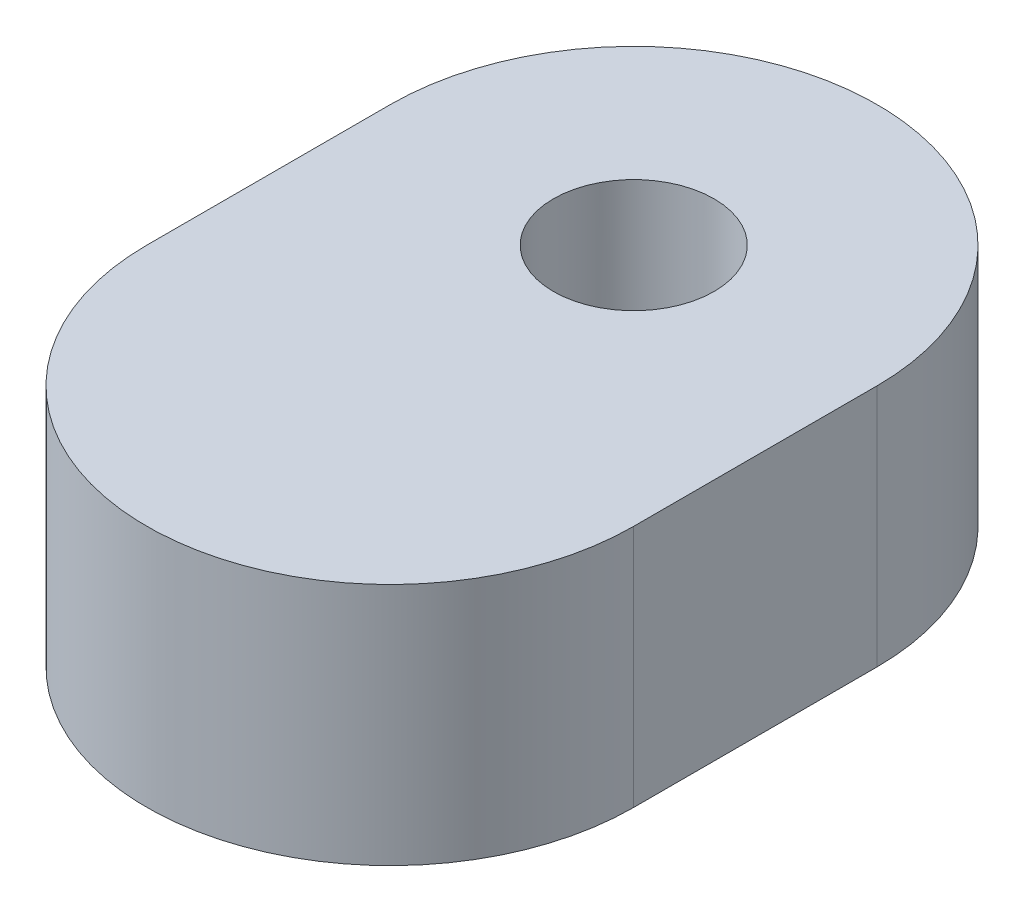
ISO-10303-21;
HEADER;
FILE_DESCRIPTION(('STEP AP214'),'2;1');
FILE_NAME('part.step','',(''),(''),'','','');
FILE_SCHEMA(('AUTOMOTIVE_DESIGN { 1 0 10303 214 1 1 1 1 }'));
ENDSEC;
DATA;
#1=APPLICATION_CONTEXT('core data for automotive mechanical design processes');
#2=APPLICATION_PROTOCOL_DEFINITION('international standard','automotive_design',2000,#1);
#3=PRODUCT_CONTEXT('',#1,'mechanical');
#4=PRODUCT('Part','Part','',(#3));
#5=PRODUCT_RELATED_PRODUCT_CATEGORY('part','',(#4));
#6=PRODUCT_DEFINITION_FORMATION('','',#4);
#7=PRODUCT_DEFINITION_CONTEXT('part definition',#1,'design');
#8=PRODUCT_DEFINITION('design','',#6,#7);
#9=PRODUCT_DEFINITION_SHAPE('','',#8);
#10=(LENGTH_UNIT() NAMED_UNIT(*) SI_UNIT(.MILLI.,.METRE.));
#11=(NAMED_UNIT(*) PLANE_ANGLE_UNIT() SI_UNIT($,.RADIAN.));
#12=(NAMED_UNIT(*) SI_UNIT($,.STERADIAN.) SOLID_ANGLE_UNIT());
#13=UNCERTAINTY_MEASURE_WITH_UNIT(LENGTH_MEASURE(1.E-05),#10,'distance_accuracy_value','');
#14=(GEOMETRIC_REPRESENTATION_CONTEXT(3) GLOBAL_UNCERTAINTY_ASSIGNED_CONTEXT((#13)) GLOBAL_UNIT_ASSIGNED_CONTEXT((#10,
#11,#12)) REPRESENTATION_CONTEXT('',''));
#15=CARTESIAN_POINT('',(0.,0.,0.));
#16=DIRECTION('',(0.,0.,1.));
#17=DIRECTION('',(1.,0.,0.));
#18=AXIS2_PLACEMENT_3D('',#15,#16,#17);
#19=CARTESIAN_POINT('',(0.,10.,0.));
#20=DIRECTION('',(0.,-1.,0.));
#21=DIRECTION('',(0.,0.,-1.));
#22=AXIS2_PLACEMENT_3D('',#19,#20,#21);
#23=CYLINDRICAL_SURFACE('',#22,3.3);
#24=CARTESIAN_POINT('',(0.,10.,0.));
#25=DIRECTION('',(0.,1.,0.));
#26=DIRECTION('',(0.,0.,1.));
#27=AXIS2_PLACEMENT_3D('',#24,#25,#26);
#28=CIRCLE('',#27,3.3);
#29=CARTESIAN_POINT('',(0.,10.,3.3));
#30=VERTEX_POINT('',#29);
#31=EDGE_CURVE('E176',#30,#30,#28,.T.);
#32=ORIENTED_EDGE('',*,*,#31,.T.);
#33=EDGE_LOOP('',(#32));
#34=FACE_BOUND('',#33,.T.);
#35=CARTESIAN_POINT('',(0.,5.,0.));
#36=DIRECTION('',(0.,-1.,0.));
#37=DIRECTION('',(0.,0.,-1.));
#38=AXIS2_PLACEMENT_3D('',#35,#36,#37);
#39=CIRCLE('',#38,3.3);
#40=CARTESIAN_POINT('',(0.,5.,-3.3));
#41=VERTEX_POINT('',#40);
#42=EDGE_CURVE('E39',#41,#41,#39,.T.);
#43=ORIENTED_EDGE('',*,*,#42,.T.);
#44=EDGE_LOOP('',(#43));
#45=FACE_BOUND('',#44,.T.);
#46=ADVANCED_FACE('F35',(#34,#45),#23,.F.);
#47=CARTESIAN_POINT('',(0.,10.,0.));
#48=DIRECTION('',(0.,1.,0.));
#49=DIRECTION('',(0.,0.,1.));
#50=AXIS2_PLACEMENT_3D('',#47,#48,#49);
#51=PLANE('',#50);
#52=CARTESIAN_POINT('',(0.,10.,0.));
#53=DIRECTION('',(0.,1.,0.));
#54=DIRECTION('',(0.,0.,1.));
#55=AXIS2_PLACEMENT_3D('',#52,#53,#54);
#56=CIRCLE('',#55,10.);
#57=CARTESIAN_POINT('',(10.,10.,0.));
#58=VERTEX_POINT('',#57);
#59=CARTESIAN_POINT('',(-10.,10.,0.));
#60=VERTEX_POINT('',#59);
#61=EDGE_CURVE('E180',#58,#60,#56,.T.);
#62=ORIENTED_EDGE('',*,*,#61,.T.);
#63=DIRECTION('',(0.,0.,1.));
#64=VECTOR('',#63,1.);
#65=CARTESIAN_POINT('',(-10.,10.,0.));
#66=LINE('',#65,#64);
#67=CARTESIAN_POINT('',(-10.,10.,10.));
#68=VERTEX_POINT('',#67);
#69=EDGE_CURVE('E88',#60,#68,#66,.T.);
#70=ORIENTED_EDGE('',*,*,#69,.T.);
#71=CARTESIAN_POINT('',(0.,10.,10.));
#72=DIRECTION('',(0.,1.,0.));
#73=DIRECTION('',(0.,0.,1.));
#74=AXIS2_PLACEMENT_3D('',#71,#72,#73);
#75=CIRCLE('',#74,10.);
#76=CARTESIAN_POINT('',(10.,10.,10.));
#77=VERTEX_POINT('',#76);
#78=EDGE_CURVE('E183',#68,#77,#75,.T.);
#79=ORIENTED_EDGE('',*,*,#78,.T.);
#80=DIRECTION('',(0.,0.,-1.));
#81=VECTOR('',#80,1.);
#82=CARTESIAN_POINT('',(10.,10.,0.));
#83=LINE('',#82,#81);
#84=EDGE_CURVE('E60',#77,#58,#83,.T.);
#85=ORIENTED_EDGE('',*,*,#84,.T.);
#86=EDGE_LOOP('',(#62,#70,#79,#85));
#87=FACE_BOUND('',#86,.T.);
#88=ORIENTED_EDGE('',*,*,#31,.F.);
#89=EDGE_LOOP('',(#88));
#90=FACE_BOUND('',#89,.T.);
#91=ADVANCED_FACE('F222',(#87,#90),#51,.T.);
#92=CARTESIAN_POINT('',(0.,0.,0.));
#93=DIRECTION('',(0.,1.,0.));
#94=DIRECTION('',(0.,0.,1.));
#95=AXIS2_PLACEMENT_3D('',#92,#93,#94);
#96=PLANE('',#95);
#97=DIRECTION('',(-0.866025403784439,0.,0.5));
#98=VECTOR('',#97,1.);
#99=CARTESIAN_POINT('',(6.5,0.,3.75277674973257));
#100=LINE('',#99,#98);
#101=CARTESIAN_POINT('',(6.5,0.,3.75277674973257));
#102=VERTEX_POINT('',#101);
#103=CARTESIAN_POINT('',(0.,0.,7.50555349946513));
#104=VERTEX_POINT('',#103);
#105=EDGE_CURVE('E157',#102,#104,#100,.T.);
#106=ORIENTED_EDGE('',*,*,#105,.F.);
#107=DIRECTION('',(0.,0.,1.));
#108=VECTOR('',#107,1.);
#109=CARTESIAN_POINT('',(6.5,0.,-3.75277674973257));
#110=LINE('',#109,#108);
#111=CARTESIAN_POINT('',(6.5,0.,-3.75277674973257));
#112=VERTEX_POINT('',#111);
#113=EDGE_CURVE('E51',#112,#102,#110,.T.);
#114=ORIENTED_EDGE('',*,*,#113,.F.);
#115=DIRECTION('',(0.866025403784439,0.,0.5));
#116=VECTOR('',#115,1.);
#117=CARTESIAN_POINT('',(0.,0.,-7.50555349946513));
#118=LINE('',#117,#116);
#119=CARTESIAN_POINT('',(0.,0.,-7.50555349946513));
#120=VERTEX_POINT('',#119);
#121=EDGE_CURVE('E143',#120,#112,#118,.T.);
#122=ORIENTED_EDGE('',*,*,#121,.F.);
#123=DIRECTION('',(0.866025403784439,0.,-0.5));
#124=VECTOR('',#123,1.);
#125=CARTESIAN_POINT('',(-6.5,0.,-3.75277674973257));
#126=LINE('',#125,#124);
#127=CARTESIAN_POINT('',(-6.5,0.,-3.75277674973257));
#128=VERTEX_POINT('',#127);
#129=EDGE_CURVE('E146',#128,#120,#126,.T.);
#130=ORIENTED_EDGE('',*,*,#129,.F.);
#131=DIRECTION('',(0.,0.,-1.));
#132=VECTOR('',#131,1.);
#133=CARTESIAN_POINT('',(-6.5,0.,3.75277674973257));
#134=LINE('',#133,#132);
#135=CARTESIAN_POINT('',(-6.5,0.,3.75277674973257));
#136=VERTEX_POINT('',#135);
#137=EDGE_CURVE('E162',#136,#128,#134,.T.);
#138=ORIENTED_EDGE('',*,*,#137,.F.);
#139=DIRECTION('',(-0.866025403784439,0.,-0.5));
#140=VECTOR('',#139,1.);
#141=CARTESIAN_POINT('',(0.,0.,7.50555349946513));
#142=LINE('',#141,#140);
#143=EDGE_CURVE('E159',#104,#136,#142,.T.);
#144=ORIENTED_EDGE('',*,*,#143,.F.);
#145=EDGE_LOOP('',(#106,#114,#122,#130,#138,#144));
#146=FACE_BOUND('',#145,.T.);
#147=CARTESIAN_POINT('',(0.,0.,0.));
#148=DIRECTION('',(0.,1.,0.));
#149=DIRECTION('',(0.,0.,1.));
#150=AXIS2_PLACEMENT_3D('',#147,#148,#149);
#151=CIRCLE('',#150,10.);
#152=CARTESIAN_POINT('',(10.,0.,0.));
#153=VERTEX_POINT('',#152);
#154=CARTESIAN_POINT('',(-10.,0.,0.));
#155=VERTEX_POINT('',#154);
#156=EDGE_CURVE('E179',#153,#155,#151,.T.);
#157=ORIENTED_EDGE('',*,*,#156,.F.);
#158=DIRECTION('',(0.,0.,-1.));
#159=VECTOR('',#158,1.);
#160=CARTESIAN_POINT('',(10.,0.,0.));
#161=LINE('',#160,#159);
#162=CARTESIAN_POINT('',(10.,0.,10.));
#163=VERTEX_POINT('',#162);
#164=EDGE_CURVE('E81',#163,#153,#161,.T.);
#165=ORIENTED_EDGE('',*,*,#164,.F.);
#166=CARTESIAN_POINT('',(0.,0.,10.));
#167=DIRECTION('',(0.,1.,0.));
#168=DIRECTION('',(0.,0.,1.));
#169=AXIS2_PLACEMENT_3D('',#166,#167,#168);
#170=CIRCLE('',#169,10.);
#171=CARTESIAN_POINT('',(-10.,0.,10.));
#172=VERTEX_POINT('',#171);
#173=EDGE_CURVE('E191',#172,#163,#170,.T.);
#174=ORIENTED_EDGE('',*,*,#173,.F.);
#175=DIRECTION('',(0.,0.,1.));
#176=VECTOR('',#175,1.);
#177=CARTESIAN_POINT('',(-10.,0.,0.));
#178=LINE('',#177,#176);
#179=EDGE_CURVE('E189',#155,#172,#178,.T.);
#180=ORIENTED_EDGE('',*,*,#179,.F.);
#181=EDGE_LOOP('',(#157,#165,#174,#180));
#182=FACE_BOUND('',#181,.T.);
#183=ADVANCED_FACE('F205',(#146,#182),#96,.F.);
#184=CARTESIAN_POINT('',(0.,10.,0.));
#185=DIRECTION('',(0.,-1.,0.));
#186=DIRECTION('',(0.,0.,-1.));
#187=AXIS2_PLACEMENT_3D('',#184,#185,#186);
#188=CYLINDRICAL_SURFACE('',#187,10.);
#189=ORIENTED_EDGE('',*,*,#156,.T.);
#190=DIRECTION('',(0.,-1.,0.));
#191=VECTOR('',#190,1.);
#192=CARTESIAN_POINT('',(-10.,10.,0.));
#193=LINE('',#192,#191);
#194=EDGE_CURVE('E11',#60,#155,#193,.T.);
#195=ORIENTED_EDGE('',*,*,#194,.F.);
#196=ORIENTED_EDGE('',*,*,#61,.F.);
#197=DIRECTION('',(0.,-1.,0.));
#198=VECTOR('',#197,1.);
#199=CARTESIAN_POINT('',(10.,10.,0.));
#200=LINE('',#199,#198);
#201=EDGE_CURVE('E186',#58,#153,#200,.T.);
#202=ORIENTED_EDGE('',*,*,#201,.T.);
#203=EDGE_LOOP('',(#189,#195,#196,#202));
#204=FACE_BOUND('',#203,.T.);
#205=ADVANCED_FACE('F37',(#204),#188,.T.);
#206=CARTESIAN_POINT('',(-10.,10.,0.));
#207=DIRECTION('',(1.,0.,0.));
#208=DIRECTION('',(0.,0.,-1.));
#209=AXIS2_PLACEMENT_3D('',#206,#207,#208);
#210=PLANE('',#209);
#211=ORIENTED_EDGE('',*,*,#179,.T.);
#212=DIRECTION('',(0.,-1.,0.));
#213=VECTOR('',#212,1.);
#214=CARTESIAN_POINT('',(-10.,10.,10.));
#215=LINE('',#214,#213);
#216=EDGE_CURVE('E44',#68,#172,#215,.T.);
#217=ORIENTED_EDGE('',*,*,#216,.F.);
#218=ORIENTED_EDGE('',*,*,#69,.F.);
#219=ORIENTED_EDGE('',*,*,#194,.T.);
#220=EDGE_LOOP('',(#211,#217,#218,#219));
#221=FACE_BOUND('',#220,.T.);
#222=ADVANCED_FACE('F218',(#221),#210,.F.);
#223=CARTESIAN_POINT('',(0.,10.,10.));
#224=DIRECTION('',(0.,-1.,0.));
#225=DIRECTION('',(0.,0.,-1.));
#226=AXIS2_PLACEMENT_3D('',#223,#224,#225);
#227=CYLINDRICAL_SURFACE('',#226,10.);
#228=ORIENTED_EDGE('',*,*,#173,.T.);
#229=DIRECTION('',(0.,-1.,0.));
#230=VECTOR('',#229,1.);
#231=CARTESIAN_POINT('',(10.,10.,10.));
#232=LINE('',#231,#230);
#233=EDGE_CURVE('E195',#77,#163,#232,.T.);
#234=ORIENTED_EDGE('',*,*,#233,.F.);
#235=ORIENTED_EDGE('',*,*,#78,.F.);
#236=ORIENTED_EDGE('',*,*,#216,.T.);
#237=EDGE_LOOP('',(#228,#234,#235,#236));
#238=FACE_BOUND('',#237,.T.);
#239=ADVANCED_FACE('F201',(#238),#227,.T.);
#240=CARTESIAN_POINT('',(10.,10.,0.));
#241=DIRECTION('',(-1.,0.,0.));
#242=DIRECTION('',(0.,0.,1.));
#243=AXIS2_PLACEMENT_3D('',#240,#241,#242);
#244=PLANE('',#243);
#245=ORIENTED_EDGE('',*,*,#164,.T.);
#246=ORIENTED_EDGE('',*,*,#201,.F.);
#247=ORIENTED_EDGE('',*,*,#84,.F.);
#248=ORIENTED_EDGE('',*,*,#233,.T.);
#249=EDGE_LOOP('',(#245,#246,#247,#248));
#250=FACE_BOUND('',#249,.T.);
#251=ADVANCED_FACE('F209',(#250),#244,.F.);
#252=CARTESIAN_POINT('',(6.5,5.,-3.75277674973257));
#253=DIRECTION('',(1.,0.,0.));
#254=DIRECTION('',(0.,0.,-1.));
#255=AXIS2_PLACEMENT_3D('',#252,#253,#254);
#256=PLANE('',#255);
#257=ORIENTED_EDGE('',*,*,#113,.T.);
#258=DIRECTION('',(0.,-1.,0.));
#259=VECTOR('',#258,1.);
#260=CARTESIAN_POINT('',(6.5,5.,3.75277674973257));
#261=LINE('',#260,#259);
#262=CARTESIAN_POINT('',(6.5,5.,3.75277674973257));
#263=VERTEX_POINT('',#262);
#264=EDGE_CURVE('E120',#263,#102,#261,.T.);
#265=ORIENTED_EDGE('',*,*,#264,.F.);
#266=DIRECTION('',(0.,0.,1.));
#267=VECTOR('',#266,1.);
#268=CARTESIAN_POINT('',(6.5,5.,-3.75277674973257));
#269=LINE('',#268,#267);
#270=CARTESIAN_POINT('',(6.5,5.,-3.75277674973257));
#271=VERTEX_POINT('',#270);
#272=EDGE_CURVE('E124',#271,#263,#269,.T.);
#273=ORIENTED_EDGE('',*,*,#272,.F.);
#274=DIRECTION('',(0.,-1.,0.));
#275=VECTOR('',#274,1.);
#276=CARTESIAN_POINT('',(6.5,5.,-3.75277674973257));
#277=LINE('',#276,#275);
#278=EDGE_CURVE('E167',#271,#112,#277,.T.);
#279=ORIENTED_EDGE('',*,*,#278,.T.);
#280=EDGE_LOOP('',(#257,#265,#273,#279));
#281=FACE_BOUND('',#280,.T.);
#282=ADVANCED_FACE('F122',(#281),#256,.F.);
#283=CARTESIAN_POINT('',(0.,5.,-7.50555349946513));
#284=DIRECTION('',(0.5,0.,-0.866025403784439));
#285=DIRECTION('',(-0.866025403784439,0.,-0.5));
#286=AXIS2_PLACEMENT_3D('',#283,#284,#285);
#287=PLANE('',#286);
#288=ORIENTED_EDGE('',*,*,#121,.T.);
#289=ORIENTED_EDGE('',*,*,#278,.F.);
#290=DIRECTION('',(0.866025403784439,0.,0.5));
#291=VECTOR('',#290,1.);
#292=CARTESIAN_POINT('',(0.,5.,-7.50555349946513));
#293=LINE('',#292,#291);
#294=CARTESIAN_POINT('',(0.,5.,-7.50555349946513));
#295=VERTEX_POINT('',#294);
#296=EDGE_CURVE('E130',#295,#271,#293,.T.);
#297=ORIENTED_EDGE('',*,*,#296,.F.);
#298=DIRECTION('',(0.,-1.,0.));
#299=VECTOR('',#298,1.);
#300=CARTESIAN_POINT('',(0.,5.,-7.50555349946513));
#301=LINE('',#300,#299);
#302=EDGE_CURVE('E169',#295,#120,#301,.T.);
#303=ORIENTED_EDGE('',*,*,#302,.T.);
#304=EDGE_LOOP('',(#288,#289,#297,#303));
#305=FACE_BOUND('',#304,.T.);
#306=ADVANCED_FACE('F216',(#305),#287,.F.);
#307=CARTESIAN_POINT('',(-6.5,5.,-3.75277674973257));
#308=DIRECTION('',(-0.5,0.,-0.866025403784438));
#309=DIRECTION('',(-0.866025403784439,0.,0.5));
#310=AXIS2_PLACEMENT_3D('',#307,#308,#309);
#311=PLANE('',#310);
#312=ORIENTED_EDGE('',*,*,#129,.T.);
#313=ORIENTED_EDGE('',*,*,#302,.F.);
#314=DIRECTION('',(0.866025403784439,0.,-0.5));
#315=VECTOR('',#314,1.);
#316=CARTESIAN_POINT('',(-6.5,5.,-3.75277674973257));
#317=LINE('',#316,#315);
#318=CARTESIAN_POINT('',(-6.5,5.,-3.75277674973257));
#319=VERTEX_POINT('',#318);
#320=EDGE_CURVE('E153',#319,#295,#317,.T.);
#321=ORIENTED_EDGE('',*,*,#320,.F.);
#322=DIRECTION('',(0.,-1.,0.));
#323=VECTOR('',#322,1.);
#324=CARTESIAN_POINT('',(-6.5,5.,-3.75277674973257));
#325=LINE('',#324,#323);
#326=EDGE_CURVE('E171',#319,#128,#325,.T.);
#327=ORIENTED_EDGE('',*,*,#326,.T.);
#328=EDGE_LOOP('',(#312,#313,#321,#327));
#329=FACE_BOUND('',#328,.T.);
#330=ADVANCED_FACE('F247',(#329),#311,.F.);
#331=CARTESIAN_POINT('',(-6.5,5.,3.75277674973257));
#332=DIRECTION('',(-1.,0.,0.));
#333=DIRECTION('',(0.,0.,1.));
#334=AXIS2_PLACEMENT_3D('',#331,#332,#333);
#335=PLANE('',#334);
#336=ORIENTED_EDGE('',*,*,#137,.T.);
#337=ORIENTED_EDGE('',*,*,#326,.F.);
#338=DIRECTION('',(0.,0.,-1.));
#339=VECTOR('',#338,1.);
#340=CARTESIAN_POINT('',(-6.5,5.,3.75277674973257));
#341=LINE('',#340,#339);
#342=CARTESIAN_POINT('',(-6.5,5.,3.75277674973257));
#343=VERTEX_POINT('',#342);
#344=EDGE_CURVE('E150',#343,#319,#341,.T.);
#345=ORIENTED_EDGE('',*,*,#344,.F.);
#346=DIRECTION('',(0.,-1.,0.));
#347=VECTOR('',#346,1.);
#348=CARTESIAN_POINT('',(-6.5,5.,3.75277674973257));
#349=LINE('',#348,#347);
#350=EDGE_CURVE('E173',#343,#136,#349,.T.);
#351=ORIENTED_EDGE('',*,*,#350,.T.);
#352=EDGE_LOOP('',(#336,#337,#345,#351));
#353=FACE_BOUND('',#352,.T.);
#354=ADVANCED_FACE('F245',(#353),#335,.F.);
#355=CARTESIAN_POINT('',(0.,5.,7.50555349946513));
#356=DIRECTION('',(-0.5,0.,0.866025403784439));
#357=DIRECTION('',(0.866025403784439,0.,0.5));
#358=AXIS2_PLACEMENT_3D('',#355,#356,#357);
#359=PLANE('',#358);
#360=ORIENTED_EDGE('',*,*,#143,.T.);
#361=ORIENTED_EDGE('',*,*,#350,.F.);
#362=DIRECTION('',(-0.866025403784439,0.,-0.5));
#363=VECTOR('',#362,1.);
#364=CARTESIAN_POINT('',(0.,5.,7.50555349946513));
#365=LINE('',#364,#363);
#366=CARTESIAN_POINT('',(0.,5.,7.50555349946513));
#367=VERTEX_POINT('',#366);
#368=EDGE_CURVE('E138',#367,#343,#365,.T.);
#369=ORIENTED_EDGE('',*,*,#368,.F.);
#370=DIRECTION('',(0.,-1.,0.));
#371=VECTOR('',#370,1.);
#372=CARTESIAN_POINT('',(0.,5.,7.50555349946513));
#373=LINE('',#372,#371);
#374=EDGE_CURVE('E129',#367,#104,#373,.T.);
#375=ORIENTED_EDGE('',*,*,#374,.T.);
#376=EDGE_LOOP('',(#360,#361,#369,#375));
#377=FACE_BOUND('',#376,.T.);
#378=ADVANCED_FACE('F241',(#377),#359,.F.);
#379=CARTESIAN_POINT('',(6.5,5.,3.75277674973257));
#380=DIRECTION('',(0.5,0.,0.866025403784439));
#381=DIRECTION('',(0.866025403784439,0.,-0.5));
#382=AXIS2_PLACEMENT_3D('',#379,#380,#381);
#383=PLANE('',#382);
#384=ORIENTED_EDGE('',*,*,#105,.T.);
#385=ORIENTED_EDGE('',*,*,#374,.F.);
#386=DIRECTION('',(-0.866025403784439,0.,0.5));
#387=VECTOR('',#386,1.);
#388=CARTESIAN_POINT('',(6.5,5.,3.75277674973257));
#389=LINE('',#388,#387);
#390=EDGE_CURVE('E133',#263,#367,#389,.T.);
#391=ORIENTED_EDGE('',*,*,#390,.F.);
#392=ORIENTED_EDGE('',*,*,#264,.T.);
#393=EDGE_LOOP('',(#384,#385,#391,#392));
#394=FACE_BOUND('',#393,.T.);
#395=ADVANCED_FACE('F134',(#394),#383,.F.);
#396=CARTESIAN_POINT('',(0.,5.,0.));
#397=DIRECTION('',(0.,-1.,0.));
#398=DIRECTION('',(0.,0.,-1.));
#399=AXIS2_PLACEMENT_3D('',#396,#397,#398);
#400=PLANE('',#399);
#401=ORIENTED_EDGE('',*,*,#42,.F.);
#402=EDGE_LOOP('',(#401));
#403=FACE_BOUND('',#402,.T.);
#404=ORIENTED_EDGE('',*,*,#272,.T.);
#405=ORIENTED_EDGE('',*,*,#390,.T.);
#406=ORIENTED_EDGE('',*,*,#368,.T.);
#407=ORIENTED_EDGE('',*,*,#344,.T.);
#408=ORIENTED_EDGE('',*,*,#320,.T.);
#409=ORIENTED_EDGE('',*,*,#296,.T.);
#410=EDGE_LOOP('',(#404,#405,#406,#407,#408,#409));
#411=FACE_BOUND('',#410,.T.);
#412=ADVANCED_FACE('F140',(#403,#411),#400,.T.);
#413=CLOSED_SHELL('',(#46,#91,#183,#205,#222,#239,#251,#282,#306,#330,#354,#378,#395,#412));
#414=MANIFOLD_SOLID_BREP('B2',#413);
#415=ADVANCED_BREP_SHAPE_REPRESENTATION('',(#18,#414),#14);
#416=SHAPE_DEFINITION_REPRESENTATION(#9,#415);
ENDSEC;
END-ISO-10303-21;
